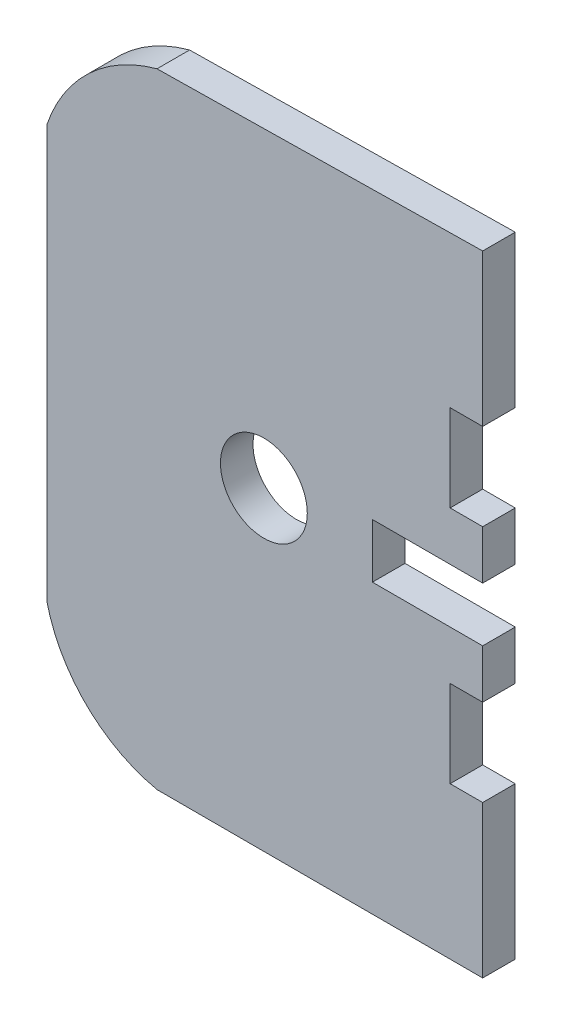
ISO-10303-21;
HEADER;
FILE_DESCRIPTION(('STEP AP214'),'2;1');
FILE_NAME('part.step','',(''),(''),'','','');
FILE_SCHEMA(('AUTOMOTIVE_DESIGN { 1 0 10303 214 1 1 1 1 }'));
ENDSEC;
DATA;
#1=APPLICATION_CONTEXT('core data for automotive mechanical design processes');
#2=APPLICATION_PROTOCOL_DEFINITION('international standard','automotive_design',2000,#1);
#3=PRODUCT_CONTEXT('',#1,'mechanical');
#4=PRODUCT('Part','Part','',(#3));
#5=PRODUCT_RELATED_PRODUCT_CATEGORY('part','',(#4));
#6=PRODUCT_DEFINITION_FORMATION('','',#4);
#7=PRODUCT_DEFINITION_CONTEXT('part definition',#1,'design');
#8=PRODUCT_DEFINITION('design','',#6,#7);
#9=PRODUCT_DEFINITION_SHAPE('','',#8);
#10=(LENGTH_UNIT() NAMED_UNIT(*) SI_UNIT(.MILLI.,.METRE.));
#11=(NAMED_UNIT(*) PLANE_ANGLE_UNIT() SI_UNIT($,.RADIAN.));
#12=(NAMED_UNIT(*) SI_UNIT($,.STERADIAN.) SOLID_ANGLE_UNIT());
#13=UNCERTAINTY_MEASURE_WITH_UNIT(LENGTH_MEASURE(1.E-05),#10,'distance_accuracy_value','');
#14=(GEOMETRIC_REPRESENTATION_CONTEXT(3) GLOBAL_UNCERTAINTY_ASSIGNED_CONTEXT((#13)) GLOBAL_UNIT_ASSIGNED_CONTEXT((#10,
#11,#12)) REPRESENTATION_CONTEXT('',''));
#15=CARTESIAN_POINT('',(0.,0.,0.));
#16=DIRECTION('',(0.,0.,1.));
#17=DIRECTION('',(1.,0.,0.));
#18=AXIS2_PLACEMENT_3D('',#15,#16,#17);
#19=CARTESIAN_POINT('',(-2.76870588625951,177.742057836201,3.));
#20=DIRECTION('',(-0.0155752109168442,0.999878699045487,0.));
#21=DIRECTION('',(-0.999878699045487,-0.0155752109168442,0.));
#22=AXIS2_PLACEMENT_3D('',#19,#20,#21);
#23=PLANE('',#22);
#24=DIRECTION('',(0.999878699045487,0.0155752109168442,0.));
#25=VECTOR('',#24,1.);
#26=CARTESIAN_POINT('',(-2.76870588625951,177.742057836201,0.));
#27=LINE('',#26,#25);
#28=CARTESIAN_POINT('',(104.119192453269,179.407061363814,0.));
#29=VERTEX_POINT('',#28);
#30=CARTESIAN_POINT('',(134.119192453269,179.874374376834,0.));
#31=VERTEX_POINT('',#30);
#32=EDGE_CURVE('E209',#29,#31,#27,.T.);
#33=ORIENTED_EDGE('',*,*,#32,.F.);
#34=DIRECTION('',(0.,0.,-1.));
#35=VECTOR('',#34,1.);
#36=CARTESIAN_POINT('',(104.119192453269,179.407061363814,3.));
#37=LINE('',#36,#35);
#38=CARTESIAN_POINT('',(104.119192453269,179.407061363814,3.));
#39=VERTEX_POINT('',#38);
#40=EDGE_CURVE('E11',#39,#29,#37,.T.);
#41=ORIENTED_EDGE('',*,*,#40,.F.);
#42=DIRECTION('',(0.999878699045487,0.0155752109168442,0.));
#43=VECTOR('',#42,1.);
#44=CARTESIAN_POINT('',(-2.76870588625951,177.742057836201,3.));
#45=LINE('',#44,#43);
#46=CARTESIAN_POINT('',(134.119192453269,179.874374376834,3.));
#47=VERTEX_POINT('',#46);
#48=EDGE_CURVE('E410',#39,#47,#45,.T.);
#49=ORIENTED_EDGE('',*,*,#48,.T.);
#50=DIRECTION('',(0.,0.,-1.));
#51=VECTOR('',#50,1.);
#52=CARTESIAN_POINT('',(134.119192453269,179.874374376834,3.));
#53=LINE('',#52,#51);
#54=EDGE_CURVE('E127',#47,#31,#53,.T.);
#55=ORIENTED_EDGE('',*,*,#54,.T.);
#56=EDGE_LOOP('',(#33,#41,#49,#55));
#57=FACE_BOUND('',#56,.T.);
#58=ADVANCED_FACE('F45',(#57),#23,.T.);
#59=CARTESIAN_POINT('',(107.973824183985,165.13454506005,3.));
#60=DIRECTION('',(0.,0.,-1.));
#61=DIRECTION('',(-1.,0.,0.));
#62=AXIS2_PLACEMENT_3D('',#59,#60,#61);
#63=CYLINDRICAL_SURFACE('',#62,14.7838732212045);
#64=CARTESIAN_POINT('',(107.973824183985,165.13454506005,0.));
#65=DIRECTION('',(0.,0.,1.));
#66=DIRECTION('',(1.,0.,0.));
#67=AXIS2_PLACEMENT_3D('',#64,#65,#66);
#68=CIRCLE('',#67,14.7838732212045);
#69=CARTESIAN_POINT('',(93.9632040227435,169.853170931855,0.));
#70=VERTEX_POINT('',#69);
#71=EDGE_CURVE('E213',#29,#70,#68,.T.);
#72=ORIENTED_EDGE('',*,*,#71,.T.);
#73=DIRECTION('',(0.,0.,-1.));
#74=VECTOR('',#73,1.);
#75=CARTESIAN_POINT('',(93.9632040227435,169.853170931855,3.));
#76=LINE('',#75,#74);
#77=CARTESIAN_POINT('',(93.9632040227435,169.853170931855,3.));
#78=VERTEX_POINT('',#77);
#79=EDGE_CURVE('E55',#78,#70,#76,.T.);
#80=ORIENTED_EDGE('',*,*,#79,.F.);
#81=CARTESIAN_POINT('',(107.973824183985,165.13454506005,3.));
#82=DIRECTION('',(0.,0.,1.));
#83=DIRECTION('',(1.,0.,0.));
#84=AXIS2_PLACEMENT_3D('',#81,#82,#83);
#85=CIRCLE('',#84,14.7838732212045);
#86=EDGE_CURVE('E413',#39,#78,#85,.T.);
#87=ORIENTED_EDGE('',*,*,#86,.F.);
#88=ORIENTED_EDGE('',*,*,#40,.T.);
#89=EDGE_LOOP('',(#72,#80,#87,#88));
#90=FACE_BOUND('',#89,.T.);
#91=ADVANCED_FACE('F333',(#90),#63,.T.);
#92=CARTESIAN_POINT('',(93.9632040227435,0.,3.));
#93=DIRECTION('',(1.,0.,0.));
#94=DIRECTION('',(0.,1.,0.));
#95=AXIS2_PLACEMENT_3D('',#92,#93,#94);
#96=PLANE('',#95);
#97=DIRECTION('',(0.,-1.,0.));
#98=VECTOR('',#97,1.);
#99=CARTESIAN_POINT('',(93.9632040227435,0.,0.));
#100=LINE('',#99,#98);
#101=CARTESIAN_POINT('',(93.9632040227435,131.895661646672,0.));
#102=VERTEX_POINT('',#101);
#103=EDGE_CURVE('E217',#70,#102,#100,.T.);
#104=ORIENTED_EDGE('',*,*,#103,.T.);
#105=DIRECTION('',(0.,0.,-1.));
#106=VECTOR('',#105,1.);
#107=CARTESIAN_POINT('',(93.9632040227435,131.895661646672,3.));
#108=LINE('',#107,#106);
#109=CARTESIAN_POINT('',(93.9632040227435,131.895661646672,3.));
#110=VERTEX_POINT('',#109);
#111=EDGE_CURVE('E319',#110,#102,#108,.T.);
#112=ORIENTED_EDGE('',*,*,#111,.F.);
#113=DIRECTION('',(0.,-1.,0.));
#114=VECTOR('',#113,1.);
#115=CARTESIAN_POINT('',(93.9632040227435,0.,3.));
#116=LINE('',#115,#114);
#117=EDGE_CURVE('E329',#78,#110,#116,.T.);
#118=ORIENTED_EDGE('',*,*,#117,.F.);
#119=ORIENTED_EDGE('',*,*,#79,.T.);
#120=EDGE_LOOP('',(#104,#112,#118,#119));
#121=FACE_BOUND('',#120,.T.);
#122=ADVANCED_FACE('F326',(#121),#96,.F.);
#123=CARTESIAN_POINT('',(106.914990913958,134.902347142505,3.));
#124=DIRECTION('',(0.,0.,-1.));
#125=DIRECTION('',(-1.,0.,0.));
#126=AXIS2_PLACEMENT_3D('',#123,#124,#125);
#127=CYLINDRICAL_SURFACE('',#126,13.2962002597088);
#128=CARTESIAN_POINT('',(106.914990913958,134.902347142505,0.));
#129=DIRECTION('',(0.,0.,1.));
#130=DIRECTION('',(1.,0.,0.));
#131=AXIS2_PLACEMENT_3D('',#128,#129,#130);
#132=CIRCLE('',#131,13.2962002597088);
#133=CARTESIAN_POINT('',(104.119206498291,121.903403691308,0.));
#134=VERTEX_POINT('',#133);
#135=EDGE_CURVE('E221',#102,#134,#132,.T.);
#136=ORIENTED_EDGE('',*,*,#135,.T.);
#137=DIRECTION('',(0.,0.,-1.));
#138=VECTOR('',#137,1.);
#139=CARTESIAN_POINT('',(104.119206498291,121.903403691308,3.));
#140=LINE('',#139,#138);
#141=CARTESIAN_POINT('',(104.119206498291,121.903403691308,3.));
#142=VERTEX_POINT('',#141);
#143=EDGE_CURVE('E315',#142,#134,#140,.T.);
#144=ORIENTED_EDGE('',*,*,#143,.F.);
#145=CARTESIAN_POINT('',(106.914990913958,134.902347142505,3.));
#146=DIRECTION('',(0.,0.,1.));
#147=DIRECTION('',(1.,0.,0.));
#148=AXIS2_PLACEMENT_3D('',#145,#146,#147);
#149=CIRCLE('',#148,13.2962002597088);
#150=EDGE_CURVE('E420',#110,#142,#149,.T.);
#151=ORIENTED_EDGE('',*,*,#150,.F.);
#152=ORIENTED_EDGE('',*,*,#111,.T.);
#153=EDGE_LOOP('',(#136,#144,#151,#152));
#154=FACE_BOUND('',#153,.T.);
#155=ADVANCED_FACE('F344',(#154),#127,.T.);
#156=CARTESIAN_POINT('',(0.118056509894106,122.004039808046,3.));
#157=DIRECTION('',(0.000967643815808402,0.999999531832613,0.));
#158=DIRECTION('',(-0.999999531832613,0.000967643815808402,0.));
#159=AXIS2_PLACEMENT_3D('',#156,#157,#158);
#160=PLANE('',#159);
#161=DIRECTION('',(0.999999531832613,-0.000967643815808402,0.));
#162=VECTOR('',#161,1.);
#163=CARTESIAN_POINT('',(0.118056509894106,122.004039808046,0.));
#164=LINE('',#163,#162);
#165=CARTESIAN_POINT('',(134.119192453269,121.874374376834,0.));
#166=VERTEX_POINT('',#165);
#167=EDGE_CURVE('E225',#134,#166,#164,.T.);
#168=ORIENTED_EDGE('',*,*,#167,.T.);
#169=DIRECTION('',(0.,0.,-1.));
#170=VECTOR('',#169,1.);
#171=CARTESIAN_POINT('',(134.119192453269,121.874374376834,3.));
#172=LINE('',#171,#170);
#173=CARTESIAN_POINT('',(134.119192453269,121.874374376834,3.));
#174=VERTEX_POINT('',#173);
#175=EDGE_CURVE('E312',#174,#166,#172,.T.);
#176=ORIENTED_EDGE('',*,*,#175,.F.);
#177=DIRECTION('',(0.999999531832613,-0.000967643815808402,0.));
#178=VECTOR('',#177,1.);
#179=CARTESIAN_POINT('',(0.118056509894106,122.004039808046,3.));
#180=LINE('',#179,#178);
#181=EDGE_CURVE('E424',#142,#174,#180,.T.);
#182=ORIENTED_EDGE('',*,*,#181,.F.);
#183=ORIENTED_EDGE('',*,*,#143,.T.);
#184=EDGE_LOOP('',(#168,#176,#182,#183));
#185=FACE_BOUND('',#184,.T.);
#186=ADVANCED_FACE('F347',(#185),#160,.F.);
#187=CARTESIAN_POINT('',(134.119192453269,0.,3.));
#188=DIRECTION('',(1.,0.,0.));
#189=DIRECTION('',(0.,0.,-1.));
#190=AXIS2_PLACEMENT_3D('',#187,#188,#189);
#191=PLANE('',#190);
#192=DIRECTION('',(0.,-1.,0.));
#193=VECTOR('',#192,1.);
#194=CARTESIAN_POINT('',(134.119192453269,0.,0.));
#195=LINE('',#194,#193);
#196=CARTESIAN_POINT('',(134.119192453269,135.874374376834,0.));
#197=VERTEX_POINT('',#196);
#198=EDGE_CURVE('E229',#197,#166,#195,.T.);
#199=ORIENTED_EDGE('',*,*,#198,.F.);
#200=DIRECTION('',(0.,0.,-1.));
#201=VECTOR('',#200,1.);
#202=CARTESIAN_POINT('',(134.119192453269,135.874374376834,3.));
#203=LINE('',#202,#201);
#204=CARTESIAN_POINT('',(134.119192453269,135.874374376834,3.));
#205=VERTEX_POINT('',#204);
#206=EDGE_CURVE('E309',#205,#197,#203,.T.);
#207=ORIENTED_EDGE('',*,*,#206,.F.);
#208=DIRECTION('',(0.,-1.,0.));
#209=VECTOR('',#208,1.);
#210=CARTESIAN_POINT('',(134.119192453269,0.,3.));
#211=LINE('',#210,#209);
#212=EDGE_CURVE('E427',#205,#174,#211,.T.);
#213=ORIENTED_EDGE('',*,*,#212,.T.);
#214=ORIENTED_EDGE('',*,*,#175,.T.);
#215=EDGE_LOOP('',(#199,#207,#213,#214));
#216=FACE_BOUND('',#215,.T.);
#217=ADVANCED_FACE('F351',(#216),#191,.T.);
#218=CARTESIAN_POINT('',(0.,135.874374376834,3.));
#219=DIRECTION('',(0.,1.,0.));
#220=DIRECTION('',(0.,0.,1.));
#221=AXIS2_PLACEMENT_3D('',#218,#219,#220);
#222=PLANE('',#221);
#223=DIRECTION('',(1.,0.,0.));
#224=VECTOR('',#223,1.);
#225=CARTESIAN_POINT('',(0.,135.874374376834,0.));
#226=LINE('',#225,#224);
#227=CARTESIAN_POINT('',(131.119192453269,135.874374376834,0.));
#228=VERTEX_POINT('',#227);
#229=EDGE_CURVE('E233',#228,#197,#226,.T.);
#230=ORIENTED_EDGE('',*,*,#229,.F.);
#231=DIRECTION('',(0.,0.,-1.));
#232=VECTOR('',#231,1.);
#233=CARTESIAN_POINT('',(131.119192453269,135.874374376834,3.));
#234=LINE('',#233,#232);
#235=CARTESIAN_POINT('',(131.119192453269,135.874374376834,3.));
#236=VERTEX_POINT('',#235);
#237=EDGE_CURVE('E306',#236,#228,#234,.T.);
#238=ORIENTED_EDGE('',*,*,#237,.F.);
#239=DIRECTION('',(1.,0.,0.));
#240=VECTOR('',#239,1.);
#241=CARTESIAN_POINT('',(0.,135.874374376834,3.));
#242=LINE('',#241,#240);
#243=EDGE_CURVE('E431',#236,#205,#242,.T.);
#244=ORIENTED_EDGE('',*,*,#243,.T.);
#245=ORIENTED_EDGE('',*,*,#206,.T.);
#246=EDGE_LOOP('',(#230,#238,#244,#245));
#247=FACE_BOUND('',#246,.T.);
#248=ADVANCED_FACE('F355',(#247),#222,.T.);
#249=CARTESIAN_POINT('',(131.119192453269,0.,3.));
#250=DIRECTION('',(-1.,0.,0.));
#251=DIRECTION('',(0.,0.,1.));
#252=AXIS2_PLACEMENT_3D('',#249,#250,#251);
#253=PLANE('',#252);
#254=DIRECTION('',(0.,1.,0.));
#255=VECTOR('',#254,1.);
#256=CARTESIAN_POINT('',(131.119192453269,0.,0.));
#257=LINE('',#256,#255);
#258=CARTESIAN_POINT('',(131.119192453269,143.874374376834,0.));
#259=VERTEX_POINT('',#258);
#260=EDGE_CURVE('E237',#228,#259,#257,.T.);
#261=ORIENTED_EDGE('',*,*,#260,.T.);
#262=DIRECTION('',(0.,0.,-1.));
#263=VECTOR('',#262,1.);
#264=CARTESIAN_POINT('',(131.119192453269,143.874374376834,3.));
#265=LINE('',#264,#263);
#266=CARTESIAN_POINT('',(131.119192453269,143.874374376834,3.));
#267=VERTEX_POINT('',#266);
#268=EDGE_CURVE('E303',#267,#259,#265,.T.);
#269=ORIENTED_EDGE('',*,*,#268,.F.);
#270=DIRECTION('',(0.,1.,0.));
#271=VECTOR('',#270,1.);
#272=CARTESIAN_POINT('',(131.119192453269,0.,3.));
#273=LINE('',#272,#271);
#274=EDGE_CURVE('E435',#236,#267,#273,.T.);
#275=ORIENTED_EDGE('',*,*,#274,.F.);
#276=ORIENTED_EDGE('',*,*,#237,.T.);
#277=EDGE_LOOP('',(#261,#269,#275,#276));
#278=FACE_BOUND('',#277,.T.);
#279=ADVANCED_FACE('F359',(#278),#253,.F.);
#280=CARTESIAN_POINT('',(0.,143.874374376834,3.));
#281=DIRECTION('',(0.,-1.,0.));
#282=DIRECTION('',(0.,0.,-1.));
#283=AXIS2_PLACEMENT_3D('',#280,#281,#282);
#284=PLANE('',#283);
#285=DIRECTION('',(-1.,0.,0.));
#286=VECTOR('',#285,1.);
#287=CARTESIAN_POINT('',(0.,143.874374376834,0.));
#288=LINE('',#287,#286);
#289=CARTESIAN_POINT('',(134.119192453269,143.874374376834,0.));
#290=VERTEX_POINT('',#289);
#291=EDGE_CURVE('E241',#290,#259,#288,.T.);
#292=ORIENTED_EDGE('',*,*,#291,.F.);
#293=DIRECTION('',(0.,0.,-1.));
#294=VECTOR('',#293,1.);
#295=CARTESIAN_POINT('',(134.119192453269,143.874374376834,3.));
#296=LINE('',#295,#294);
#297=CARTESIAN_POINT('',(134.119192453269,143.874374376834,3.));
#298=VERTEX_POINT('',#297);
#299=EDGE_CURVE('E300',#298,#290,#296,.T.);
#300=ORIENTED_EDGE('',*,*,#299,.F.);
#301=DIRECTION('',(-1.,0.,0.));
#302=VECTOR('',#301,1.);
#303=CARTESIAN_POINT('',(0.,143.874374376834,3.));
#304=LINE('',#303,#302);
#305=EDGE_CURVE('E438',#298,#267,#304,.T.);
#306=ORIENTED_EDGE('',*,*,#305,.T.);
#307=ORIENTED_EDGE('',*,*,#268,.T.);
#308=EDGE_LOOP('',(#292,#300,#306,#307));
#309=FACE_BOUND('',#308,.T.);
#310=ADVANCED_FACE('F363',(#309),#284,.T.);
#311=CARTESIAN_POINT('',(134.119192453269,0.,3.));
#312=DIRECTION('',(1.,0.,0.));
#313=DIRECTION('',(0.,0.,-1.));
#314=AXIS2_PLACEMENT_3D('',#311,#312,#313);
#315=PLANE('',#314);
#316=DIRECTION('',(0.,-1.,0.));
#317=VECTOR('',#316,1.);
#318=CARTESIAN_POINT('',(134.119192453269,0.,0.));
#319=LINE('',#318,#317);
#320=CARTESIAN_POINT('',(134.119192453269,148.374336283808,0.));
#321=VERTEX_POINT('',#320);
#322=EDGE_CURVE('E245',#321,#290,#319,.T.);
#323=ORIENTED_EDGE('',*,*,#322,.F.);
#324=DIRECTION('',(0.,0.,-1.));
#325=VECTOR('',#324,1.);
#326=CARTESIAN_POINT('',(134.119192453269,148.374336283808,3.));
#327=LINE('',#326,#325);
#328=CARTESIAN_POINT('',(134.119192453269,148.374336283808,3.));
#329=VERTEX_POINT('',#328);
#330=EDGE_CURVE('E297',#329,#321,#327,.T.);
#331=ORIENTED_EDGE('',*,*,#330,.F.);
#332=DIRECTION('',(0.,-1.,0.));
#333=VECTOR('',#332,1.);
#334=CARTESIAN_POINT('',(134.119192453269,0.,3.));
#335=LINE('',#334,#333);
#336=EDGE_CURVE('E442',#329,#298,#335,.T.);
#337=ORIENTED_EDGE('',*,*,#336,.T.);
#338=ORIENTED_EDGE('',*,*,#299,.T.);
#339=EDGE_LOOP('',(#323,#331,#337,#338));
#340=FACE_BOUND('',#339,.T.);
#341=ADVANCED_FACE('F367',(#340),#315,.T.);
#342=CARTESIAN_POINT('',(0.,148.374336283808,3.));
#343=DIRECTION('',(0.,-1.,0.));
#344=DIRECTION('',(0.,0.,-1.));
#345=AXIS2_PLACEMENT_3D('',#342,#343,#344);
#346=PLANE('',#345);
#347=DIRECTION('',(-1.,0.,0.));
#348=VECTOR('',#347,1.);
#349=CARTESIAN_POINT('',(0.,148.374336283808,0.));
#350=LINE('',#349,#348);
#351=CARTESIAN_POINT('',(123.963204022663,148.374336283808,0.));
#352=VERTEX_POINT('',#351);
#353=EDGE_CURVE('E249',#321,#352,#350,.T.);
#354=ORIENTED_EDGE('',*,*,#353,.T.);
#355=DIRECTION('',(0.,0.,-1.));
#356=VECTOR('',#355,1.);
#357=CARTESIAN_POINT('',(123.963204022663,148.374336283808,3.));
#358=LINE('',#357,#356);
#359=CARTESIAN_POINT('',(123.963204022663,148.374336283808,3.));
#360=VERTEX_POINT('',#359);
#361=EDGE_CURVE('E293',#360,#352,#358,.T.);
#362=ORIENTED_EDGE('',*,*,#361,.F.);
#363=DIRECTION('',(-1.,0.,0.));
#364=VECTOR('',#363,1.);
#365=CARTESIAN_POINT('',(0.,148.374336283808,3.));
#366=LINE('',#365,#364);
#367=EDGE_CURVE('E446',#329,#360,#366,.T.);
#368=ORIENTED_EDGE('',*,*,#367,.F.);
#369=ORIENTED_EDGE('',*,*,#330,.T.);
#370=EDGE_LOOP('',(#354,#362,#368,#369));
#371=FACE_BOUND('',#370,.T.);
#372=ADVANCED_FACE('F371',(#371),#346,.F.);
#373=CARTESIAN_POINT('',(123.963204022663,0.,3.));
#374=DIRECTION('',(-1.,0.,0.));
#375=DIRECTION('',(0.,0.,1.));
#376=AXIS2_PLACEMENT_3D('',#373,#374,#375);
#377=PLANE('',#376);
#378=DIRECTION('',(0.,1.,0.));
#379=VECTOR('',#378,1.);
#380=CARTESIAN_POINT('',(123.963204022663,0.,0.));
#381=LINE('',#380,#379);
#382=CARTESIAN_POINT('',(123.963204022663,153.374336283808,0.));
#383=VERTEX_POINT('',#382);
#384=EDGE_CURVE('E253',#352,#383,#381,.T.);
#385=ORIENTED_EDGE('',*,*,#384,.T.);
#386=DIRECTION('',(0.,0.,-1.));
#387=VECTOR('',#386,1.);
#388=CARTESIAN_POINT('',(123.963204022663,153.374336283808,3.));
#389=LINE('',#388,#387);
#390=CARTESIAN_POINT('',(123.963204022663,153.374336283808,3.));
#391=VERTEX_POINT('',#390);
#392=EDGE_CURVE('E290',#391,#383,#389,.T.);
#393=ORIENTED_EDGE('',*,*,#392,.F.);
#394=DIRECTION('',(0.,1.,0.));
#395=VECTOR('',#394,1.);
#396=CARTESIAN_POINT('',(123.963204022663,0.,3.));
#397=LINE('',#396,#395);
#398=EDGE_CURVE('E450',#360,#391,#397,.T.);
#399=ORIENTED_EDGE('',*,*,#398,.F.);
#400=ORIENTED_EDGE('',*,*,#361,.T.);
#401=EDGE_LOOP('',(#385,#393,#399,#400));
#402=FACE_BOUND('',#401,.T.);
#403=ADVANCED_FACE('F375',(#402),#377,.F.);
#404=CARTESIAN_POINT('',(0.,153.374336283808,3.));
#405=DIRECTION('',(0.,-1.,0.));
#406=DIRECTION('',(0.,0.,-1.));
#407=AXIS2_PLACEMENT_3D('',#404,#405,#406);
#408=PLANE('',#407);
#409=DIRECTION('',(-1.,0.,0.));
#410=VECTOR('',#409,1.);
#411=CARTESIAN_POINT('',(0.,153.374336283808,0.));
#412=LINE('',#411,#410);
#413=CARTESIAN_POINT('',(134.119192453269,153.374336283808,0.));
#414=VERTEX_POINT('',#413);
#415=EDGE_CURVE('E257',#414,#383,#412,.T.);
#416=ORIENTED_EDGE('',*,*,#415,.F.);
#417=DIRECTION('',(0.,0.,-1.));
#418=VECTOR('',#417,1.);
#419=CARTESIAN_POINT('',(134.119192453269,153.374336283808,3.));
#420=LINE('',#419,#418);
#421=CARTESIAN_POINT('',(134.119192453269,153.374336283808,3.));
#422=VERTEX_POINT('',#421);
#423=EDGE_CURVE('E287',#422,#414,#420,.T.);
#424=ORIENTED_EDGE('',*,*,#423,.F.);
#425=DIRECTION('',(-1.,0.,0.));
#426=VECTOR('',#425,1.);
#427=CARTESIAN_POINT('',(0.,153.374336283808,3.));
#428=LINE('',#427,#426);
#429=EDGE_CURVE('E453',#422,#391,#428,.T.);
#430=ORIENTED_EDGE('',*,*,#429,.T.);
#431=ORIENTED_EDGE('',*,*,#392,.T.);
#432=EDGE_LOOP('',(#416,#424,#430,#431));
#433=FACE_BOUND('',#432,.T.);
#434=ADVANCED_FACE('F379',(#433),#408,.T.);
#435=CARTESIAN_POINT('',(134.11919245327,8.27227528009808E-13,3.));
#436=DIRECTION('',(1.,0.,0.));
#437=DIRECTION('',(0.,1.,0.));
#438=AXIS2_PLACEMENT_3D('',#435,#436,#437);
#439=PLANE('',#438);
#440=DIRECTION('',(0.,-1.,0.));
#441=VECTOR('',#440,1.);
#442=CARTESIAN_POINT('',(134.11919245327,8.27227528009808E-13,0.));
#443=LINE('',#442,#441);
#444=CARTESIAN_POINT('',(134.119192453269,157.874374376834,0.));
#445=VERTEX_POINT('',#444);
#446=EDGE_CURVE('E261',#445,#414,#443,.T.);
#447=ORIENTED_EDGE('',*,*,#446,.F.);
#448=DIRECTION('',(0.,0.,-1.));
#449=VECTOR('',#448,1.);
#450=CARTESIAN_POINT('',(134.119192453269,157.874374376834,3.));
#451=LINE('',#450,#449);
#452=CARTESIAN_POINT('',(134.119192453269,157.874374376834,3.));
#453=VERTEX_POINT('',#452);
#454=EDGE_CURVE('E284',#453,#445,#451,.T.);
#455=ORIENTED_EDGE('',*,*,#454,.F.);
#456=DIRECTION('',(0.,-1.,0.));
#457=VECTOR('',#456,1.);
#458=CARTESIAN_POINT('',(134.11919245327,8.27227528009808E-13,3.));
#459=LINE('',#458,#457);
#460=EDGE_CURVE('E457',#453,#422,#459,.T.);
#461=ORIENTED_EDGE('',*,*,#460,.T.);
#462=ORIENTED_EDGE('',*,*,#423,.T.);
#463=EDGE_LOOP('',(#447,#455,#461,#462));
#464=FACE_BOUND('',#463,.T.);
#465=ADVANCED_FACE('F383',(#464),#439,.T.);
#466=CARTESIAN_POINT('',(0.,157.874374376834,3.));
#467=DIRECTION('',(0.,1.,0.));
#468=DIRECTION('',(0.,0.,1.));
#469=AXIS2_PLACEMENT_3D('',#466,#467,#468);
#470=PLANE('',#469);
#471=DIRECTION('',(1.,0.,0.));
#472=VECTOR('',#471,1.);
#473=CARTESIAN_POINT('',(0.,157.874374376834,0.));
#474=LINE('',#473,#472);
#475=CARTESIAN_POINT('',(131.119192453269,157.874374376834,0.));
#476=VERTEX_POINT('',#475);
#477=EDGE_CURVE('E265',#476,#445,#474,.T.);
#478=ORIENTED_EDGE('',*,*,#477,.F.);
#479=DIRECTION('',(0.,0.,-1.));
#480=VECTOR('',#479,1.);
#481=CARTESIAN_POINT('',(131.119192453269,157.874374376834,3.));
#482=LINE('',#481,#480);
#483=CARTESIAN_POINT('',(131.119192453269,157.874374376834,3.));
#484=VERTEX_POINT('',#483);
#485=EDGE_CURVE('E196',#484,#476,#482,.T.);
#486=ORIENTED_EDGE('',*,*,#485,.F.);
#487=DIRECTION('',(1.,0.,0.));
#488=VECTOR('',#487,1.);
#489=CARTESIAN_POINT('',(0.,157.874374376834,3.));
#490=LINE('',#489,#488);
#491=EDGE_CURVE('E183',#484,#453,#490,.T.);
#492=ORIENTED_EDGE('',*,*,#491,.T.);
#493=ORIENTED_EDGE('',*,*,#454,.T.);
#494=EDGE_LOOP('',(#478,#486,#492,#493));
#495=FACE_BOUND('',#494,.T.);
#496=ADVANCED_FACE('F387',(#495),#470,.T.);
#497=CARTESIAN_POINT('',(131.119192453269,0.,3.));
#498=DIRECTION('',(-1.,0.,0.));
#499=DIRECTION('',(0.,0.,1.));
#500=AXIS2_PLACEMENT_3D('',#497,#498,#499);
#501=PLANE('',#500);
#502=DIRECTION('',(0.,1.,0.));
#503=VECTOR('',#502,1.);
#504=CARTESIAN_POINT('',(131.119192453269,0.,0.));
#505=LINE('',#504,#503);
#506=CARTESIAN_POINT('',(131.119192453269,165.874374376834,0.));
#507=VERTEX_POINT('',#506);
#508=EDGE_CURVE('E191',#476,#507,#505,.T.);
#509=ORIENTED_EDGE('',*,*,#508,.T.);
#510=DIRECTION('',(0.,0.,-1.));
#511=VECTOR('',#510,1.);
#512=CARTESIAN_POINT('',(131.119192453269,165.874374376834,3.));
#513=LINE('',#512,#511);
#514=CARTESIAN_POINT('',(131.119192453269,165.874374376834,3.));
#515=VERTEX_POINT('',#514);
#516=EDGE_CURVE('E188',#515,#507,#513,.T.);
#517=ORIENTED_EDGE('',*,*,#516,.F.);
#518=DIRECTION('',(0.,1.,0.));
#519=VECTOR('',#518,1.);
#520=CARTESIAN_POINT('',(131.119192453269,0.,3.));
#521=LINE('',#520,#519);
#522=EDGE_CURVE('E176',#484,#515,#521,.T.);
#523=ORIENTED_EDGE('',*,*,#522,.F.);
#524=ORIENTED_EDGE('',*,*,#485,.T.);
#525=EDGE_LOOP('',(#509,#517,#523,#524));
#526=FACE_BOUND('',#525,.T.);
#527=ADVANCED_FACE('F189',(#526),#501,.F.);
#528=CARTESIAN_POINT('',(0.,165.874374376834,3.));
#529=DIRECTION('',(0.,-1.,0.));
#530=DIRECTION('',(0.,0.,-1.));
#531=AXIS2_PLACEMENT_3D('',#528,#529,#530);
#532=PLANE('',#531);
#533=DIRECTION('',(-1.,0.,0.));
#534=VECTOR('',#533,1.);
#535=CARTESIAN_POINT('',(0.,165.874374376834,0.));
#536=LINE('',#535,#534);
#537=CARTESIAN_POINT('',(134.119192453269,165.874374376834,0.));
#538=VERTEX_POINT('',#537);
#539=EDGE_CURVE('E271',#538,#507,#536,.T.);
#540=ORIENTED_EDGE('',*,*,#539,.F.);
#541=DIRECTION('',(0.,0.,-1.));
#542=VECTOR('',#541,1.);
#543=CARTESIAN_POINT('',(134.119192453269,165.874374376834,3.));
#544=LINE('',#543,#542);
#545=CARTESIAN_POINT('',(134.119192453269,165.874374376834,3.));
#546=VERTEX_POINT('',#545);
#547=EDGE_CURVE('E120',#546,#538,#544,.T.);
#548=ORIENTED_EDGE('',*,*,#547,.F.);
#549=DIRECTION('',(-1.,0.,0.));
#550=VECTOR('',#549,1.);
#551=CARTESIAN_POINT('',(0.,165.874374376834,3.));
#552=LINE('',#551,#550);
#553=EDGE_CURVE('E180',#546,#515,#552,.T.);
#554=ORIENTED_EDGE('',*,*,#553,.T.);
#555=ORIENTED_EDGE('',*,*,#516,.T.);
#556=EDGE_LOOP('',(#540,#548,#554,#555));
#557=FACE_BOUND('',#556,.T.);
#558=ADVANCED_FACE('F198',(#557),#532,.T.);
#559=CARTESIAN_POINT('',(113.963204022663,150.874376286536,3.));
#560=DIRECTION('',(0.,0.,-1.));
#561=DIRECTION('',(-1.,0.,0.));
#562=AXIS2_PLACEMENT_3D('',#559,#560,#561);
#563=CYLINDRICAL_SURFACE('',#562,4.00000000000001);
#564=CARTESIAN_POINT('',(113.963204022663,150.874376286536,3.));
#565=DIRECTION('',(0.,0.,1.));
#566=DIRECTION('',(1.,0.,0.));
#567=AXIS2_PLACEMENT_3D('',#564,#565,#566);
#568=CIRCLE('',#567,4.00000000000001);
#569=CARTESIAN_POINT('',(117.963204022663,150.874376286536,3.));
#570=VERTEX_POINT('',#569);
#571=EDGE_CURVE('E277',#570,#570,#568,.T.);
#572=ORIENTED_EDGE('',*,*,#571,.T.);
#573=EDGE_LOOP('',(#572));
#574=FACE_BOUND('',#573,.T.);
#575=CARTESIAN_POINT('',(113.963204022663,150.874376286536,0.));
#576=DIRECTION('',(0.,0.,1.));
#577=DIRECTION('',(1.,0.,0.));
#578=AXIS2_PLACEMENT_3D('',#575,#576,#577);
#579=CIRCLE('',#578,4.00000000000001);
#580=CARTESIAN_POINT('',(117.963204022663,150.874376286536,0.));
#581=VERTEX_POINT('',#580);
#582=EDGE_CURVE('E205',#581,#581,#579,.T.);
#583=ORIENTED_EDGE('',*,*,#582,.F.);
#584=EDGE_LOOP('',(#583));
#585=FACE_BOUND('',#584,.T.);
#586=ADVANCED_FACE('F47',(#574,#585),#563,.F.);
#587=CARTESIAN_POINT('',(134.119192453269,0.,3.));
#588=DIRECTION('',(-1.,0.,0.));
#589=DIRECTION('',(0.,0.,1.));
#590=AXIS2_PLACEMENT_3D('',#587,#588,#589);
#591=PLANE('',#590);
#592=DIRECTION('',(0.,1.,0.));
#593=VECTOR('',#592,1.);
#594=CARTESIAN_POINT('',(134.119192453269,0.,0.));
#595=LINE('',#594,#593);
#596=EDGE_CURVE('E274',#538,#31,#595,.T.);
#597=ORIENTED_EDGE('',*,*,#596,.T.);
#598=ORIENTED_EDGE('',*,*,#54,.F.);
#599=DIRECTION('',(0.,1.,0.));
#600=VECTOR('',#599,1.);
#601=CARTESIAN_POINT('',(134.119192453269,0.,3.));
#602=LINE('',#601,#600);
#603=EDGE_CURVE('E63',#546,#47,#602,.T.);
#604=ORIENTED_EDGE('',*,*,#603,.F.);
#605=ORIENTED_EDGE('',*,*,#547,.T.);
#606=EDGE_LOOP('',(#597,#598,#604,#605));
#607=FACE_BOUND('',#606,.T.);
#608=ADVANCED_FACE('F396',(#607),#591,.F.);
#609=CARTESIAN_POINT('',(0.,0.,3.));
#610=DIRECTION('',(0.,0.,1.));
#611=DIRECTION('',(1.,0.,0.));
#612=AXIS2_PLACEMENT_3D('',#609,#610,#611);
#613=PLANE('',#612);
#614=ORIENTED_EDGE('',*,*,#571,.F.);
#615=EDGE_LOOP('',(#614));
#616=FACE_BOUND('',#615,.T.);
#617=ORIENTED_EDGE('',*,*,#48,.F.);
#618=ORIENTED_EDGE('',*,*,#86,.T.);
#619=ORIENTED_EDGE('',*,*,#117,.T.);
#620=ORIENTED_EDGE('',*,*,#150,.T.);
#621=ORIENTED_EDGE('',*,*,#181,.T.);
#622=ORIENTED_EDGE('',*,*,#212,.F.);
#623=ORIENTED_EDGE('',*,*,#243,.F.);
#624=ORIENTED_EDGE('',*,*,#274,.T.);
#625=ORIENTED_EDGE('',*,*,#305,.F.);
#626=ORIENTED_EDGE('',*,*,#336,.F.);
#627=ORIENTED_EDGE('',*,*,#367,.T.);
#628=ORIENTED_EDGE('',*,*,#398,.T.);
#629=ORIENTED_EDGE('',*,*,#429,.F.);
#630=ORIENTED_EDGE('',*,*,#460,.F.);
#631=ORIENTED_EDGE('',*,*,#491,.F.);
#632=ORIENTED_EDGE('',*,*,#522,.T.);
#633=ORIENTED_EDGE('',*,*,#553,.F.);
#634=ORIENTED_EDGE('',*,*,#603,.T.);
#635=EDGE_LOOP('',(#617,#618,#619,#620,#621,#622,#623,#624,#625,#626,#627,#628,#629,#630,#631,
#632,#633,#634));
#636=FACE_BOUND('',#635,.T.);
#637=ADVANCED_FACE('F178',(#616,#636),#613,.T.);
#638=CARTESIAN_POINT('',(0.,0.,0.));
#639=DIRECTION('',(0.,0.,1.));
#640=DIRECTION('',(1.,0.,0.));
#641=AXIS2_PLACEMENT_3D('',#638,#639,#640);
#642=PLANE('',#641);
#643=ORIENTED_EDGE('',*,*,#582,.T.);
#644=EDGE_LOOP('',(#643));
#645=FACE_BOUND('',#644,.T.);
#646=ORIENTED_EDGE('',*,*,#32,.T.);
#647=ORIENTED_EDGE('',*,*,#596,.F.);
#648=ORIENTED_EDGE('',*,*,#539,.T.);
#649=ORIENTED_EDGE('',*,*,#508,.F.);
#650=ORIENTED_EDGE('',*,*,#477,.T.);
#651=ORIENTED_EDGE('',*,*,#446,.T.);
#652=ORIENTED_EDGE('',*,*,#415,.T.);
#653=ORIENTED_EDGE('',*,*,#384,.F.);
#654=ORIENTED_EDGE('',*,*,#353,.F.);
#655=ORIENTED_EDGE('',*,*,#322,.T.);
#656=ORIENTED_EDGE('',*,*,#291,.T.);
#657=ORIENTED_EDGE('',*,*,#260,.F.);
#658=ORIENTED_EDGE('',*,*,#229,.T.);
#659=ORIENTED_EDGE('',*,*,#198,.T.);
#660=ORIENTED_EDGE('',*,*,#167,.F.);
#661=ORIENTED_EDGE('',*,*,#135,.F.);
#662=ORIENTED_EDGE('',*,*,#103,.F.);
#663=ORIENTED_EDGE('',*,*,#71,.F.);
#664=EDGE_LOOP('',(#646,#647,#648,#649,#650,#651,#652,#653,#654,#655,#656,#657,#658,#659,#660,
#661,#662,#663));
#665=FACE_BOUND('',#664,.T.);
#666=ADVANCED_FACE('F335',(#645,#665),#642,.F.);
#667=CLOSED_SHELL('',(#58,#91,#122,#155,#186,#217,#248,#279,#310,#341,#372,#403,#434,#465,#496,
#527,#558,#586,#608,#637,#666));
#668=MANIFOLD_SOLID_BREP('B2',#667);
#669=ADVANCED_BREP_SHAPE_REPRESENTATION('',(#18,#668),#14);
#670=SHAPE_DEFINITION_REPRESENTATION(#9,#669);
ENDSEC;
END-ISO-10303-21;
